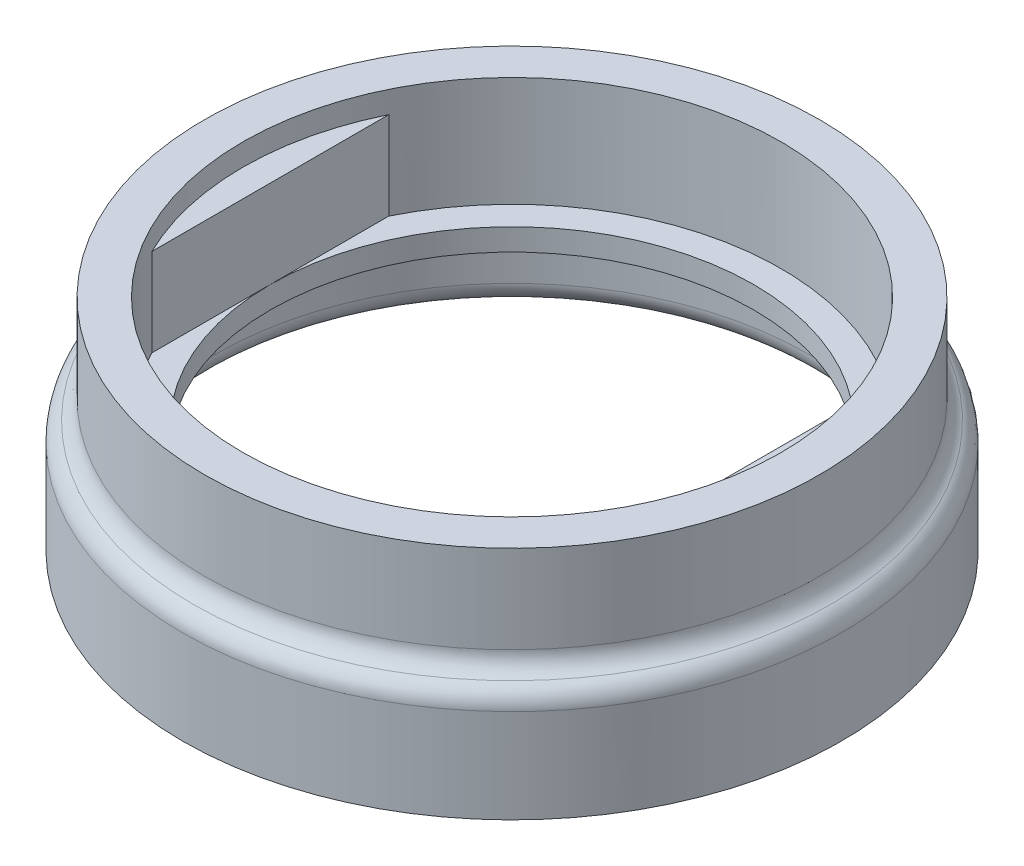
ISO-10303-21;
HEADER;
FILE_DESCRIPTION(('STEP AP214'),'2;1');
FILE_NAME('part.step','',(''),(''),'','','');
FILE_SCHEMA(('AUTOMOTIVE_DESIGN { 1 0 10303 214 1 1 1 1 }'));
ENDSEC;
DATA;
#1=APPLICATION_CONTEXT('core data for automotive mechanical design processes');
#2=APPLICATION_PROTOCOL_DEFINITION('international standard','automotive_design',2000,#1);
#3=PRODUCT_CONTEXT('',#1,'mechanical');
#4=PRODUCT('Part','Part','',(#3));
#5=PRODUCT_RELATED_PRODUCT_CATEGORY('part','',(#4));
#6=PRODUCT_DEFINITION_FORMATION('','',#4);
#7=PRODUCT_DEFINITION_CONTEXT('part definition',#1,'design');
#8=PRODUCT_DEFINITION('design','',#6,#7);
#9=PRODUCT_DEFINITION_SHAPE('','',#8);
#10=(LENGTH_UNIT() NAMED_UNIT(*) SI_UNIT(.MILLI.,.METRE.));
#11=(NAMED_UNIT(*) PLANE_ANGLE_UNIT() SI_UNIT($,.RADIAN.));
#12=(NAMED_UNIT(*) SI_UNIT($,.STERADIAN.) SOLID_ANGLE_UNIT());
#13=UNCERTAINTY_MEASURE_WITH_UNIT(LENGTH_MEASURE(1.E-05),#10,'distance_accuracy_value','');
#14=(GEOMETRIC_REPRESENTATION_CONTEXT(3) GLOBAL_UNCERTAINTY_ASSIGNED_CONTEXT((#13)) GLOBAL_UNIT_ASSIGNED_CONTEXT((#10,
#11,#12)) REPRESENTATION_CONTEXT('',''));
#15=CARTESIAN_POINT('',(0.,0.,0.));
#16=DIRECTION('',(0.,0.,1.));
#17=DIRECTION('',(1.,0.,0.));
#18=AXIS2_PLACEMENT_3D('',#15,#16,#17);
#19=CARTESIAN_POINT('',(0.,5.,0.));
#20=DIRECTION('',(0.,-1.,0.));
#21=DIRECTION('',(0.,0.,-1.));
#22=AXIS2_PLACEMENT_3D('',#19,#20,#21);
#23=CYLINDRICAL_SURFACE('',#22,12.25);
#24=CARTESIAN_POINT('',(0.,5.,0.));
#25=DIRECTION('',(0.,1.,0.));
#26=DIRECTION('',(0.,0.,1.));
#27=AXIS2_PLACEMENT_3D('',#24,#25,#26);
#28=CIRCLE('',#27,12.25);
#29=CARTESIAN_POINT('',(0.,5.,12.25));
#30=VERTEX_POINT('',#29);
#31=EDGE_CURVE('E132',#30,#30,#28,.T.);
#32=ORIENTED_EDGE('',*,*,#31,.T.);
#33=EDGE_LOOP('',(#32));
#34=FACE_BOUND('',#33,.T.);
#35=CARTESIAN_POINT('',(0.,4.,0.));
#36=DIRECTION('',(0.,1.,0.));
#37=DIRECTION('',(0.,0.,-1.));
#38=AXIS2_PLACEMENT_3D('',#35,#36,#37);
#39=CIRCLE('',#38,12.25);
#40=CARTESIAN_POINT('',(11.,4.,5.39096466321196));
#41=VERTEX_POINT('',#40);
#42=CARTESIAN_POINT('',(11.,4.,-5.39096466321196));
#43=VERTEX_POINT('',#42);
#44=EDGE_CURVE('E219',#41,#43,#39,.T.);
#45=ORIENTED_EDGE('',*,*,#44,.F.);
#46=DIRECTION('',(0.,-1.,0.));
#47=VECTOR('',#46,1.);
#48=CARTESIAN_POINT('',(11.,4.,5.39096466321196));
#49=LINE('',#48,#47);
#50=CARTESIAN_POINT('',(11.,0.,5.39096466321196));
#51=VERTEX_POINT('',#50);
#52=EDGE_CURVE('E123',#41,#51,#49,.T.);
#53=ORIENTED_EDGE('',*,*,#52,.T.);
#54=CARTESIAN_POINT('',(0.,0.,0.));
#55=DIRECTION('',(0.,1.,0.));
#56=DIRECTION('',(0.,0.,1.));
#57=AXIS2_PLACEMENT_3D('',#54,#55,#56);
#58=CIRCLE('',#57,12.25);
#59=CARTESIAN_POINT('',(-11.,0.,5.39096466321196));
#60=VERTEX_POINT('',#59);
#61=EDGE_CURVE('E137',#60,#51,#58,.T.);
#62=ORIENTED_EDGE('',*,*,#61,.F.);
#63=DIRECTION('',(0.,-1.,0.));
#64=VECTOR('',#63,1.);
#65=CARTESIAN_POINT('',(-11.,4.,5.39096466321196));
#66=LINE('',#65,#64);
#67=CARTESIAN_POINT('',(-11.,4.,5.39096466321196));
#68=VERTEX_POINT('',#67);
#69=EDGE_CURVE('E113',#68,#60,#66,.T.);
#70=ORIENTED_EDGE('',*,*,#69,.F.);
#71=CARTESIAN_POINT('',(0.,4.,0.));
#72=DIRECTION('',(0.,1.,0.));
#73=DIRECTION('',(0.,0.,1.));
#74=AXIS2_PLACEMENT_3D('',#71,#72,#73);
#75=CIRCLE('',#74,12.25);
#76=CARTESIAN_POINT('',(-11.,4.,-5.39096466321196));
#77=VERTEX_POINT('',#76);
#78=EDGE_CURVE('E116',#77,#68,#75,.T.);
#79=ORIENTED_EDGE('',*,*,#78,.F.);
#80=DIRECTION('',(0.,-1.,0.));
#81=VECTOR('',#80,1.);
#82=CARTESIAN_POINT('',(-11.,4.,-5.39096466321196));
#83=LINE('',#82,#81);
#84=CARTESIAN_POINT('',(-11.,0.,-5.39096466321196));
#85=VERTEX_POINT('',#84);
#86=EDGE_CURVE('E127',#77,#85,#83,.T.);
#87=ORIENTED_EDGE('',*,*,#86,.T.);
#88=CARTESIAN_POINT('',(11.,0.,-5.39096466321196));
#89=VERTEX_POINT('',#88);
#90=EDGE_CURVE('E92',#89,#85,#58,.T.);
#91=ORIENTED_EDGE('',*,*,#90,.F.);
#92=DIRECTION('',(0.,-1.,0.));
#93=VECTOR('',#92,1.);
#94=CARTESIAN_POINT('',(11.,4.,-5.39096466321196));
#95=LINE('',#94,#93);
#96=EDGE_CURVE('E117',#43,#89,#95,.T.);
#97=ORIENTED_EDGE('',*,*,#96,.F.);
#98=EDGE_LOOP('',(#45,#53,#62,#70,#79,#87,#91,#97));
#99=FACE_BOUND('',#98,.T.);
#100=ADVANCED_FACE('F39',(#34,#99),#23,.F.);
#101=CARTESIAN_POINT('',(0.,5.,0.));
#102=DIRECTION('',(0.,1.,0.));
#103=DIRECTION('',(0.,0.,1.));
#104=AXIS2_PLACEMENT_3D('',#101,#102,#103);
#105=PLANE('',#104);
#106=CARTESIAN_POINT('',(0.,5.,0.));
#107=DIRECTION('',(0.,1.,0.));
#108=DIRECTION('',(0.,0.,1.));
#109=AXIS2_PLACEMENT_3D('',#106,#107,#108);
#110=CIRCLE('',#109,14.);
#111=CARTESIAN_POINT('',(0.,5.,14.));
#112=VERTEX_POINT('',#111);
#113=EDGE_CURVE('E136',#112,#112,#110,.T.);
#114=ORIENTED_EDGE('',*,*,#113,.T.);
#115=EDGE_LOOP('',(#114));
#116=FACE_BOUND('',#115,.T.);
#117=ORIENTED_EDGE('',*,*,#31,.F.);
#118=EDGE_LOOP('',(#117));
#119=FACE_BOUND('',#118,.T.);
#120=ADVANCED_FACE('F171',(#116,#119),#105,.T.);
#121=CARTESIAN_POINT('',(0.,5.,0.));
#122=DIRECTION('',(0.,-1.,0.));
#123=DIRECTION('',(0.,0.,-1.));
#124=AXIS2_PLACEMENT_3D('',#121,#122,#123);
#125=CYLINDRICAL_SURFACE('',#124,14.);
#126=CARTESIAN_POINT('',(0.,1.,0.));
#127=DIRECTION('',(0.,1.,0.));
#128=DIRECTION('',(0.,0.,1.));
#129=AXIS2_PLACEMENT_3D('',#126,#127,#128);
#130=CIRCLE('',#129,14.);
#131=CARTESIAN_POINT('',(0.,1.,14.));
#132=VERTEX_POINT('',#131);
#133=EDGE_CURVE('E143',#132,#132,#130,.T.);
#134=ORIENTED_EDGE('',*,*,#133,.T.);
#135=EDGE_LOOP('',(#134));
#136=FACE_BOUND('',#135,.T.);
#137=ORIENTED_EDGE('',*,*,#113,.F.);
#138=EDGE_LOOP('',(#137));
#139=FACE_BOUND('',#138,.T.);
#140=ADVANCED_FACE('F177',(#136,#139),#125,.T.);
#141=CARTESIAN_POINT('',(-11.,4.,-5.39096466321196));
#142=DIRECTION('',(-1.,0.,0.));
#143=DIRECTION('',(0.,0.,1.));
#144=AXIS2_PLACEMENT_3D('',#141,#142,#143);
#145=PLANE('',#144);
#146=DIRECTION('',(0.,0.,-1.));
#147=VECTOR('',#146,1.);
#148=CARTESIAN_POINT('',(-11.,0.,-5.39096466321196));
#149=LINE('',#148,#147);
#150=CARTESIAN_POINT('',(-11.,0.,0.));
#151=VERTEX_POINT('',#150);
#152=EDGE_CURVE('E105',#60,#151,#149,.T.);
#153=ORIENTED_EDGE('',*,*,#152,.T.);
#154=DIRECTION('',(0.,0.,1.));
#155=VECTOR('',#154,1.);
#156=CARTESIAN_POINT('',(-11.,0.,-5.39096466321196));
#157=LINE('',#156,#155);
#158=EDGE_CURVE('E87',#85,#151,#157,.T.);
#159=ORIENTED_EDGE('',*,*,#158,.F.);
#160=ORIENTED_EDGE('',*,*,#86,.F.);
#161=DIRECTION('',(0.,0.,-1.));
#162=VECTOR('',#161,1.);
#163=CARTESIAN_POINT('',(-11.,4.,-5.39096466321196));
#164=LINE('',#163,#162);
#165=EDGE_CURVE('E61',#68,#77,#164,.T.);
#166=ORIENTED_EDGE('',*,*,#165,.F.);
#167=ORIENTED_EDGE('',*,*,#69,.T.);
#168=EDGE_LOOP('',(#153,#159,#160,#166,#167));
#169=FACE_BOUND('',#168,.T.);
#170=ADVANCED_FACE('F111',(#169),#145,.F.);
#171=CARTESIAN_POINT('',(0.,4.,0.));
#172=DIRECTION('',(0.,1.,0.));
#173=DIRECTION('',(0.,0.,1.));
#174=AXIS2_PLACEMENT_3D('',#171,#172,#173);
#175=PLANE('',#174);
#176=ORIENTED_EDGE('',*,*,#78,.T.);
#177=ORIENTED_EDGE('',*,*,#165,.T.);
#178=EDGE_LOOP('',(#176,#177));
#179=FACE_BOUND('',#178,.T.);
#180=ADVANCED_FACE('F262',(#179),#175,.T.);
#181=CARTESIAN_POINT('',(11.,4.,-5.39096466321196));
#182=DIRECTION('',(1.,0.,0.));
#183=DIRECTION('',(0.,0.,-1.));
#184=AXIS2_PLACEMENT_3D('',#181,#182,#183);
#185=PLANE('',#184);
#186=DIRECTION('',(0.,0.,1.));
#187=VECTOR('',#186,1.);
#188=CARTESIAN_POINT('',(11.,0.,-5.39096466321196));
#189=LINE('',#188,#187);
#190=CARTESIAN_POINT('',(11.,0.,0.));
#191=VERTEX_POINT('',#190);
#192=EDGE_CURVE('E216',#89,#191,#189,.T.);
#193=ORIENTED_EDGE('',*,*,#192,.T.);
#194=DIRECTION('',(0.,0.,-1.));
#195=VECTOR('',#194,1.);
#196=CARTESIAN_POINT('',(11.,0.,-5.39096466321196));
#197=LINE('',#196,#195);
#198=EDGE_CURVE('E98',#51,#191,#197,.T.);
#199=ORIENTED_EDGE('',*,*,#198,.F.);
#200=ORIENTED_EDGE('',*,*,#52,.F.);
#201=DIRECTION('',(0.,0.,1.));
#202=VECTOR('',#201,1.);
#203=CARTESIAN_POINT('',(11.,4.,-5.39096466321196));
#204=LINE('',#203,#202);
#205=EDGE_CURVE('E226',#43,#41,#204,.T.);
#206=ORIENTED_EDGE('',*,*,#205,.F.);
#207=ORIENTED_EDGE('',*,*,#96,.T.);
#208=EDGE_LOOP('',(#193,#199,#200,#206,#207));
#209=FACE_BOUND('',#208,.T.);
#210=ADVANCED_FACE('F235',(#209),#185,.F.);
#211=CARTESIAN_POINT('',(0.,4.,0.));
#212=DIRECTION('',(0.,-1.,0.));
#213=DIRECTION('',(0.,0.,-1.));
#214=AXIS2_PLACEMENT_3D('',#211,#212,#213);
#215=PLANE('',#214);
#216=ORIENTED_EDGE('',*,*,#44,.T.);
#217=ORIENTED_EDGE('',*,*,#205,.T.);
#218=EDGE_LOOP('',(#216,#217));
#219=FACE_BOUND('',#218,.T.);
#220=ADVANCED_FACE('F211',(#219),#215,.F.);
#221=CARTESIAN_POINT('',(0.,-5.,0.));
#222=DIRECTION('',(0.,1.,0.));
#223=DIRECTION('',(0.,0.,1.));
#224=AXIS2_PLACEMENT_3D('',#221,#222,#223);
#225=CYLINDRICAL_SURFACE('',#224,15.);
#226=CARTESIAN_POINT('',(0.,-0.732050807569321,0.));
#227=DIRECTION('',(0.,-1.,0.));
#228=DIRECTION('',(0.,0.,-1.));
#229=AXIS2_PLACEMENT_3D('',#226,#227,#228);
#230=CIRCLE('',#229,15.);
#231=CARTESIAN_POINT('',(0.,-0.732050807569321,-15.));
#232=VERTEX_POINT('',#231);
#233=EDGE_CURVE('E151',#232,#232,#230,.T.);
#234=ORIENTED_EDGE('',*,*,#233,.T.);
#235=EDGE_LOOP('',(#234));
#236=FACE_BOUND('',#235,.T.);
#237=CARTESIAN_POINT('',(0.,-5.,0.));
#238=DIRECTION('',(0.,1.,0.));
#239=DIRECTION('',(0.,0.,1.));
#240=AXIS2_PLACEMENT_3D('',#237,#238,#239);
#241=CIRCLE('',#240,15.);
#242=CARTESIAN_POINT('',(0.,-5.,15.));
#243=VERTEX_POINT('',#242);
#244=EDGE_CURVE('E97',#243,#243,#241,.T.);
#245=ORIENTED_EDGE('',*,*,#244,.T.);
#246=EDGE_LOOP('',(#245));
#247=FACE_BOUND('',#246,.T.);
#248=ADVANCED_FACE('F208',(#236,#247),#225,.T.);
#249=CARTESIAN_POINT('',(0.,-5.,0.));
#250=DIRECTION('',(0.,1.,0.));
#251=DIRECTION('',(0.,0.,1.));
#252=AXIS2_PLACEMENT_3D('',#249,#250,#251);
#253=PLANE('',#252);
#254=CARTESIAN_POINT('',(0.,-5.,0.));
#255=DIRECTION('',(0.,1.,0.));
#256=DIRECTION('',(0.,0.,1.));
#257=AXIS2_PLACEMENT_3D('',#254,#255,#256);
#258=CIRCLE('',#257,14.5);
#259=CARTESIAN_POINT('',(0.,-5.,14.5));
#260=VERTEX_POINT('',#259);
#261=EDGE_CURVE('E48',#260,#260,#258,.T.);
#262=ORIENTED_EDGE('',*,*,#261,.T.);
#263=EDGE_LOOP('',(#262));
#264=FACE_BOUND('',#263,.T.);
#265=ORIENTED_EDGE('',*,*,#244,.F.);
#266=EDGE_LOOP('',(#265));
#267=FACE_BOUND('',#266,.T.);
#268=ADVANCED_FACE('F158',(#264,#267),#253,.F.);
#269=CARTESIAN_POINT('',(0.,-5.,0.));
#270=DIRECTION('',(0.,1.,0.));
#271=DIRECTION('',(0.,0.,1.));
#272=AXIS2_PLACEMENT_3D('',#269,#270,#271);
#273=CYLINDRICAL_SURFACE('',#272,13.5);
#274=CARTESIAN_POINT('',(0.,-4.,0.));
#275=DIRECTION('',(0.,1.,0.));
#276=DIRECTION('',(0.,0.,1.));
#277=AXIS2_PLACEMENT_3D('',#274,#275,#276);
#278=CIRCLE('',#277,13.5);
#279=CARTESIAN_POINT('',(0.,-4.,13.5));
#280=VERTEX_POINT('',#279);
#281=EDGE_CURVE('E11',#280,#280,#278,.F.);
#282=ORIENTED_EDGE('',*,*,#281,.T.);
#283=EDGE_LOOP('',(#282));
#284=FACE_BOUND('',#283,.T.);
#285=CARTESIAN_POINT('',(0.,-1.,0.));
#286=DIRECTION('',(0.,-1.,0.));
#287=DIRECTION('',(0.,0.,-1.));
#288=AXIS2_PLACEMENT_3D('',#285,#286,#287);
#289=CIRCLE('',#288,13.5);
#290=CARTESIAN_POINT('',(0.,-1.,-13.5));
#291=VERTEX_POINT('',#290);
#292=EDGE_CURVE('E237',#291,#291,#289,.T.);
#293=ORIENTED_EDGE('',*,*,#292,.F.);
#294=EDGE_LOOP('',(#293));
#295=FACE_BOUND('',#294,.T.);
#296=ADVANCED_FACE('F190',(#284,#295),#273,.F.);
#297=CARTESIAN_POINT('',(0.,1.,0.));
#298=DIRECTION('',(0.,1.,0.));
#299=DIRECTION('',(0.,0.,1.));
#300=AXIS2_PLACEMENT_3D('',#297,#298,#299);
#301=TOROIDAL_SURFACE('',#300,15.,1.);
#302=CARTESIAN_POINT('',(0.,0.133974596215389,0.));
#303=DIRECTION('',(0.,1.,0.));
#304=DIRECTION('',(0.,0.,1.));
#305=AXIS2_PLACEMENT_3D('',#302,#303,#304);
#306=CIRCLE('',#305,14.5000000000001);
#307=CARTESIAN_POINT('',(0.,0.133974596215389,14.5000000000001));
#308=VERTEX_POINT('',#307);
#309=EDGE_CURVE('E147',#308,#308,#306,.T.);
#310=ORIENTED_EDGE('',*,*,#309,.T.);
#311=EDGE_LOOP('',(#310));
#312=FACE_BOUND('',#311,.T.);
#313=ORIENTED_EDGE('',*,*,#133,.F.);
#314=EDGE_LOOP('',(#313));
#315=FACE_BOUND('',#314,.T.);
#316=ADVANCED_FACE('F187',(#312,#315),#301,.F.);
#317=CARTESIAN_POINT('',(0.,-0.732050807569322,0.));
#318=DIRECTION('',(0.,-1.,0.));
#319=DIRECTION('',(0.,0.,-1.));
#320=AXIS2_PLACEMENT_3D('',#317,#318,#319);
#321=TOROIDAL_SURFACE('',#320,14.0000000000002,1.);
#322=ORIENTED_EDGE('',*,*,#233,.F.);
#323=EDGE_LOOP('',(#322));
#324=FACE_BOUND('',#323,.T.);
#325=ORIENTED_EDGE('',*,*,#309,.F.);
#326=EDGE_LOOP('',(#325));
#327=FACE_BOUND('',#326,.T.);
#328=ADVANCED_FACE('F189',(#324,#327),#321,.T.);
#329=CARTESIAN_POINT('',(0.,0.,0.));
#330=DIRECTION('',(0.,-1.,0.));
#331=DIRECTION('',(0.,0.,-1.));
#332=AXIS2_PLACEMENT_3D('',#329,#330,#331);
#333=PLANE('',#332);
#334=ORIENTED_EDGE('',*,*,#90,.T.);
#335=ORIENTED_EDGE('',*,*,#158,.T.);
#336=CARTESIAN_POINT('',(0.,0.,0.));
#337=DIRECTION('',(0.,-1.,0.));
#338=DIRECTION('',(0.,0.,-1.));
#339=AXIS2_PLACEMENT_3D('',#336,#337,#338);
#340=CIRCLE('',#339,11.);
#341=EDGE_CURVE('E89',#151,#191,#340,.T.);
#342=ORIENTED_EDGE('',*,*,#341,.T.);
#343=ORIENTED_EDGE('',*,*,#192,.F.);
#344=EDGE_LOOP('',(#334,#335,#342,#343));
#345=FACE_BOUND('',#344,.T.);
#346=ADVANCED_FACE('F88',(#345),#333,.F.);
#347=EDGE_CURVE('E54',#191,#151,#340,.T.);
#348=ORIENTED_EDGE('',*,*,#347,.T.);
#349=ORIENTED_EDGE('',*,*,#152,.F.);
#350=ORIENTED_EDGE('',*,*,#61,.T.);
#351=ORIENTED_EDGE('',*,*,#198,.T.);
#352=EDGE_LOOP('',(#348,#349,#350,#351));
#353=FACE_BOUND('',#352,.T.);
#354=ADVANCED_FACE('F104',(#353),#333,.F.);
#355=CARTESIAN_POINT('',(0.,-1.,0.));
#356=DIRECTION('',(0.,-1.,0.));
#357=DIRECTION('',(0.,0.,-1.));
#358=AXIS2_PLACEMENT_3D('',#355,#356,#357);
#359=PLANE('',#358);
#360=ORIENTED_EDGE('',*,*,#292,.T.);
#361=EDGE_LOOP('',(#360));
#362=FACE_BOUND('',#361,.T.);
#363=CARTESIAN_POINT('',(0.,-1.,0.));
#364=DIRECTION('',(0.,-1.,0.));
#365=DIRECTION('',(0.,0.,-1.));
#366=AXIS2_PLACEMENT_3D('',#363,#364,#365);
#367=CIRCLE('',#366,11.);
#368=CARTESIAN_POINT('',(0.,-1.,-11.));
#369=VERTEX_POINT('',#368);
#370=EDGE_CURVE('E110',#369,#369,#367,.T.);
#371=ORIENTED_EDGE('',*,*,#370,.F.);
#372=EDGE_LOOP('',(#371));
#373=FACE_BOUND('',#372,.T.);
#374=ADVANCED_FACE('F166',(#362,#373),#359,.T.);
#375=CARTESIAN_POINT('',(0.,-1.,0.));
#376=DIRECTION('',(0.,1.,0.));
#377=DIRECTION('',(0.,0.,1.));
#378=AXIS2_PLACEMENT_3D('',#375,#376,#377);
#379=CYLINDRICAL_SURFACE('',#378,11.);
#380=ORIENTED_EDGE('',*,*,#370,.T.);
#381=EDGE_LOOP('',(#380));
#382=FACE_BOUND('',#381,.T.);
#383=ORIENTED_EDGE('',*,*,#347,.F.);
#384=ORIENTED_EDGE('',*,*,#341,.F.);
#385=EDGE_LOOP('',(#383,#384));
#386=FACE_BOUND('',#385,.T.);
#387=ADVANCED_FACE('F100',(#382,#386),#379,.F.);
#388=CARTESIAN_POINT('',(0.,-4.,0.));
#389=DIRECTION('',(0.,1.,0.));
#390=DIRECTION('',(0.,0.,1.));
#391=AXIS2_PLACEMENT_3D('',#388,#389,#390);
#392=TOROIDAL_SURFACE('',#391,14.5,1.);
#393=ORIENTED_EDGE('',*,*,#281,.F.);
#394=EDGE_LOOP('',(#393));
#395=FACE_BOUND('',#394,.T.);
#396=ORIENTED_EDGE('',*,*,#261,.F.);
#397=EDGE_LOOP('',(#396));
#398=FACE_BOUND('',#397,.T.);
#399=ADVANCED_FACE('F41',(#395,#398),#392,.T.);
#400=CLOSED_SHELL('',(#100,#120,#140,#170,#180,#210,#220,#248,#268,#296,#316,#328,#346,#354,
#374,#387,#399));
#401=MANIFOLD_SOLID_BREP('B2',#400);
#402=ADVANCED_BREP_SHAPE_REPRESENTATION('',(#18,#401),#14);
#403=SHAPE_DEFINITION_REPRESENTATION(#9,#402);
ENDSEC;
END-ISO-10303-21;
